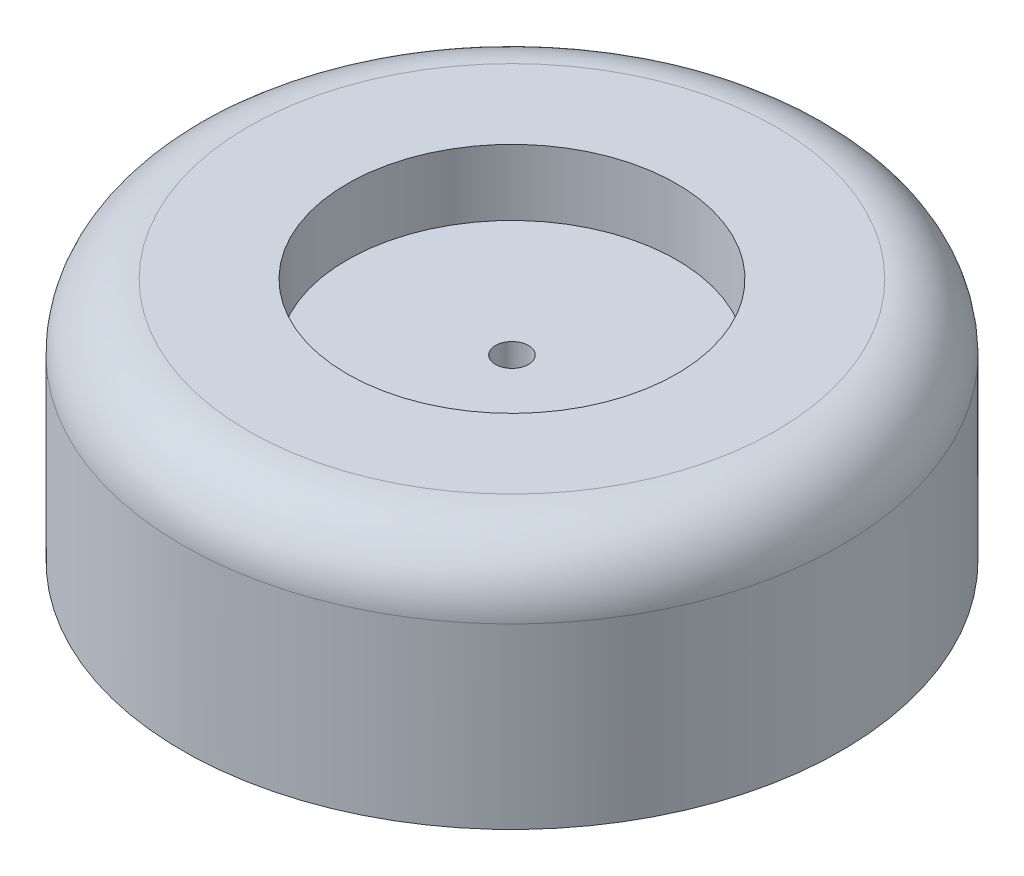
ISO-10303-21;
HEADER;
FILE_DESCRIPTION(('STEP AP214'),'2;1');
FILE_NAME('part.step','',(''),(''),'','','');
FILE_SCHEMA(('AUTOMOTIVE_DESIGN { 1 0 10303 214 1 1 1 1 }'));
ENDSEC;
DATA;
#1=APPLICATION_CONTEXT('core data for automotive mechanical design processes');
#2=APPLICATION_PROTOCOL_DEFINITION('international standard','automotive_design',2000,#1);
#3=PRODUCT_CONTEXT('',#1,'mechanical');
#4=PRODUCT('Part','Part','',(#3));
#5=PRODUCT_RELATED_PRODUCT_CATEGORY('part','',(#4));
#6=PRODUCT_DEFINITION_FORMATION('','',#4);
#7=PRODUCT_DEFINITION_CONTEXT('part definition',#1,'design');
#8=PRODUCT_DEFINITION('design','',#6,#7);
#9=PRODUCT_DEFINITION_SHAPE('','',#8);
#10=(LENGTH_UNIT() NAMED_UNIT(*) SI_UNIT(.MILLI.,.METRE.));
#11=(NAMED_UNIT(*) PLANE_ANGLE_UNIT() SI_UNIT($,.RADIAN.));
#12=(NAMED_UNIT(*) SI_UNIT($,.STERADIAN.) SOLID_ANGLE_UNIT());
#13=UNCERTAINTY_MEASURE_WITH_UNIT(LENGTH_MEASURE(1.E-05),#10,'distance_accuracy_value','');
#14=(GEOMETRIC_REPRESENTATION_CONTEXT(3) GLOBAL_UNCERTAINTY_ASSIGNED_CONTEXT((#13)) GLOBAL_UNIT_ASSIGNED_CONTEXT((#10,
#11,#12)) REPRESENTATION_CONTEXT('',''));
#15=CARTESIAN_POINT('',(0.,0.,0.));
#16=DIRECTION('',(0.,0.,1.));
#17=DIRECTION('',(1.,0.,0.));
#18=AXIS2_PLACEMENT_3D('',#15,#16,#17);
#19=CARTESIAN_POINT('',(0.,3.,0.));
#20=DIRECTION('',(0.,1.,0.));
#21=DIRECTION('',(0.,0.,1.));
#22=AXIS2_PLACEMENT_3D('',#19,#20,#21);
#23=CYLINDRICAL_SURFACE('',#22,2.5);
#24=CARTESIAN_POINT('',(0.,10.,0.));
#25=DIRECTION('',(0.,1.,0.));
#26=DIRECTION('',(0.,0.,1.));
#27=AXIS2_PLACEMENT_3D('',#24,#25,#26);
#28=CIRCLE('',#27,2.5);
#29=CARTESIAN_POINT('',(0.,10.,2.5));
#30=VERTEX_POINT('',#29);
#31=EDGE_CURVE('E141',#30,#30,#28,.T.);
#32=ORIENTED_EDGE('',*,*,#31,.F.);
#33=EDGE_LOOP('',(#32));
#34=FACE_BOUND('',#33,.T.);
#35=CARTESIAN_POINT('',(0.,30.,0.));
#36=DIRECTION('',(0.,1.,0.));
#37=DIRECTION('',(0.,0.,1.));
#38=AXIS2_PLACEMENT_3D('',#35,#36,#37);
#39=CIRCLE('',#38,2.5);
#40=CARTESIAN_POINT('',(0.,30.,2.5));
#41=VERTEX_POINT('',#40);
#42=EDGE_CURVE('E49',#41,#41,#39,.F.);
#43=ORIENTED_EDGE('',*,*,#42,.F.);
#44=EDGE_LOOP('',(#43));
#45=FACE_BOUND('',#44,.T.);
#46=ADVANCED_FACE('F45',(#34,#45),#23,.F.);
#47=CARTESIAN_POINT('',(0.,10.,0.));
#48=DIRECTION('',(0.,-1.,0.));
#49=DIRECTION('',(0.,0.,-1.));
#50=AXIS2_PLACEMENT_3D('',#47,#48,#49);
#51=CYLINDRICAL_SURFACE('',#50,47.5);
#52=CARTESIAN_POINT('',(0.,10.,0.));
#53=DIRECTION('',(0.,1.,0.));
#54=DIRECTION('',(0.,0.,1.));
#55=AXIS2_PLACEMENT_3D('',#52,#53,#54);
#56=CIRCLE('',#55,47.5);
#57=CARTESIAN_POINT('',(0.,10.,47.5));
#58=VERTEX_POINT('',#57);
#59=EDGE_CURVE('E69',#58,#58,#56,.T.);
#60=ORIENTED_EDGE('',*,*,#59,.T.);
#61=EDGE_LOOP('',(#60));
#62=FACE_BOUND('',#61,.T.);
#63=CARTESIAN_POINT('',(0.,3.,0.));
#64=DIRECTION('',(0.,-1.,0.));
#65=DIRECTION('',(0.,0.,-1.));
#66=AXIS2_PLACEMENT_3D('',#63,#64,#65);
#67=CIRCLE('',#66,47.5);
#68=CARTESIAN_POINT('',(0.,3.,-47.5));
#69=VERTEX_POINT('',#68);
#70=EDGE_CURVE('E70',#69,#69,#67,.T.);
#71=ORIENTED_EDGE('',*,*,#70,.T.);
#72=EDGE_LOOP('',(#71));
#73=FACE_BOUND('',#72,.T.);
#74=ADVANCED_FACE('F106',(#62,#73),#51,.F.);
#75=CARTESIAN_POINT('',(0.,10.,0.));
#76=DIRECTION('',(0.,1.,0.));
#77=DIRECTION('',(0.,0.,1.));
#78=AXIS2_PLACEMENT_3D('',#75,#76,#77);
#79=PLANE('',#78);
#80=ORIENTED_EDGE('',*,*,#59,.F.);
#81=EDGE_LOOP('',(#80));
#82=FACE_BOUND('',#81,.T.);
#83=CARTESIAN_POINT('',(0.,10.,0.));
#84=DIRECTION('',(0.,1.,0.));
#85=DIRECTION('',(0.,0.,1.));
#86=AXIS2_PLACEMENT_3D('',#83,#84,#85);
#87=CIRCLE('',#86,45.);
#88=CARTESIAN_POINT('',(45.,10.,0.));
#89=VERTEX_POINT('',#88);
#90=EDGE_CURVE('E67',#89,#89,#87,.T.);
#91=ORIENTED_EDGE('',*,*,#90,.T.);
#92=EDGE_LOOP('',(#91));
#93=FACE_BOUND('',#92,.T.);
#94=ADVANCED_FACE('F113',(#82,#93),#79,.F.);
#95=CARTESIAN_POINT('',(0.,10.,0.));
#96=DIRECTION('',(0.,-1.,0.));
#97=DIRECTION('',(0.,0.,-1.));
#98=AXIS2_PLACEMENT_3D('',#95,#96,#97);
#99=TOROIDAL_SURFACE('',#98,42.5,2.5);
#100=CARTESIAN_POINT('',(42.5,10.,0.));
#101=DIRECTION('',(0.,0.,1.));
#102=DIRECTION('',(1.,0.,0.));
#103=AXIS2_PLACEMENT_3D('',#100,#101,#102);
#104=CIRCLE('',#103,2.5);
#105=CARTESIAN_POINT('',(40.,10.,0.));
#106=VERTEX_POINT('',#105);
#107=EDGE_CURVE('E62',#89,#106,#104,.T.);
#108=ORIENTED_EDGE('',*,*,#107,.T.);
#109=CARTESIAN_POINT('',(0.,10.,0.));
#110=DIRECTION('',(0.,-1.,0.));
#111=DIRECTION('',(0.,0.,-1.));
#112=AXIS2_PLACEMENT_3D('',#109,#110,#111);
#113=CIRCLE('',#112,40.);
#114=EDGE_CURVE('E65',#106,#106,#113,.T.);
#115=ORIENTED_EDGE('',*,*,#114,.F.);
#116=ORIENTED_EDGE('',*,*,#107,.F.);
#117=ORIENTED_EDGE('',*,*,#90,.F.);
#118=EDGE_LOOP('',(#108,#115,#116,#117));
#119=FACE_BOUND('',#118,.T.);
#120=ADVANCED_FACE('F63',(#119),#99,.F.);
#121=ORIENTED_EDGE('',*,*,#31,.T.);
#122=EDGE_LOOP('',(#121));
#123=FACE_BOUND('',#122,.T.);
#124=ORIENTED_EDGE('',*,*,#114,.T.);
#125=EDGE_LOOP('',(#124));
#126=FACE_BOUND('',#125,.T.);
#127=ADVANCED_FACE('F123',(#123,#126),#79,.F.);
#128=CARTESIAN_POINT('',(0.,3.,0.));
#129=DIRECTION('',(0.,-1.,0.));
#130=DIRECTION('',(0.,0.,-1.));
#131=AXIS2_PLACEMENT_3D('',#128,#129,#130);
#132=PLANE('',#131);
#133=ORIENTED_EDGE('',*,*,#70,.F.);
#134=EDGE_LOOP('',(#133));
#135=FACE_BOUND('',#134,.T.);
#136=CARTESIAN_POINT('',(0.,3.,0.));
#137=DIRECTION('',(0.,-1.,0.));
#138=DIRECTION('',(0.,0.,-1.));
#139=AXIS2_PLACEMENT_3D('',#136,#137,#138);
#140=CIRCLE('',#139,50.);
#141=CARTESIAN_POINT('',(0.,3.,-50.));
#142=VERTEX_POINT('',#141);
#143=EDGE_CURVE('E77',#142,#142,#140,.T.);
#144=ORIENTED_EDGE('',*,*,#143,.T.);
#145=EDGE_LOOP('',(#144));
#146=FACE_BOUND('',#145,.T.);
#147=ADVANCED_FACE('F120',(#135,#146),#132,.T.);
#148=CARTESIAN_POINT('',(0.,40.,0.));
#149=DIRECTION('',(0.,1.,0.));
#150=DIRECTION('',(0.,0.,1.));
#151=AXIS2_PLACEMENT_3D('',#148,#149,#150);
#152=PLANE('',#151);
#153=CARTESIAN_POINT('',(0.,40.,0.));
#154=DIRECTION('',(0.,1.,0.));
#155=DIRECTION('',(0.,0.,1.));
#156=AXIS2_PLACEMENT_3D('',#153,#154,#155);
#157=CIRCLE('',#156,25.);
#158=CARTESIAN_POINT('',(0.,40.,25.));
#159=VERTEX_POINT('',#158);
#160=EDGE_CURVE('E149',#159,#159,#157,.T.);
#161=ORIENTED_EDGE('',*,*,#160,.F.);
#162=EDGE_LOOP('',(#161));
#163=FACE_BOUND('',#162,.T.);
#164=CARTESIAN_POINT('',(0.,40.,0.));
#165=DIRECTION('',(0.,1.,0.));
#166=DIRECTION('',(0.,0.,1.));
#167=AXIS2_PLACEMENT_3D('',#164,#165,#166);
#168=CIRCLE('',#167,40.);
#169=CARTESIAN_POINT('',(0.,40.,40.));
#170=VERTEX_POINT('',#169);
#171=EDGE_CURVE('E55',#170,#170,#168,.T.);
#172=ORIENTED_EDGE('',*,*,#171,.T.);
#173=EDGE_LOOP('',(#172));
#174=FACE_BOUND('',#173,.T.);
#175=ADVANCED_FACE('F90',(#163,#174),#152,.T.);
#176=CARTESIAN_POINT('',(0.,10.,0.));
#177=DIRECTION('',(0.,-1.,0.));
#178=DIRECTION('',(0.,0.,-1.));
#179=AXIS2_PLACEMENT_3D('',#176,#177,#178);
#180=CYLINDRICAL_SURFACE('',#179,50.);
#181=CARTESIAN_POINT('',(0.,30.,0.));
#182=DIRECTION('',(0.,1.,0.));
#183=DIRECTION('',(0.,0.,1.));
#184=AXIS2_PLACEMENT_3D('',#181,#182,#183);
#185=CIRCLE('',#184,50.);
#186=CARTESIAN_POINT('',(0.,30.,50.));
#187=VERTEX_POINT('',#186);
#188=EDGE_CURVE('E11',#187,#187,#185,.F.);
#189=ORIENTED_EDGE('',*,*,#188,.T.);
#190=EDGE_LOOP('',(#189));
#191=FACE_BOUND('',#190,.T.);
#192=ORIENTED_EDGE('',*,*,#143,.F.);
#193=EDGE_LOOP('',(#192));
#194=FACE_BOUND('',#193,.T.);
#195=ADVANCED_FACE('F94',(#191,#194),#180,.T.);
#196=CARTESIAN_POINT('',(0.,30.,0.));
#197=DIRECTION('',(0.,1.,0.));
#198=DIRECTION('',(0.,0.,1.));
#199=AXIS2_PLACEMENT_3D('',#196,#197,#198);
#200=TOROIDAL_SURFACE('',#199,40.,10.);
#201=ORIENTED_EDGE('',*,*,#188,.F.);
#202=EDGE_LOOP('',(#201));
#203=FACE_BOUND('',#202,.T.);
#204=ORIENTED_EDGE('',*,*,#171,.F.);
#205=EDGE_LOOP('',(#204));
#206=FACE_BOUND('',#205,.T.);
#207=ADVANCED_FACE('F47',(#203,#206),#200,.T.);
#208=CARTESIAN_POINT('',(0.,30.,0.));
#209=DIRECTION('',(0.,1.,0.));
#210=DIRECTION('',(0.,0.,1.));
#211=AXIS2_PLACEMENT_3D('',#208,#209,#210);
#212=PLANE('',#211);
#213=CARTESIAN_POINT('',(0.,30.,0.));
#214=DIRECTION('',(0.,1.,0.));
#215=DIRECTION('',(0.,0.,1.));
#216=AXIS2_PLACEMENT_3D('',#213,#214,#215);
#217=CIRCLE('',#216,25.);
#218=CARTESIAN_POINT('',(0.,30.,25.));
#219=VERTEX_POINT('',#218);
#220=EDGE_CURVE('E147',#219,#219,#217,.T.);
#221=ORIENTED_EDGE('',*,*,#220,.T.);
#222=EDGE_LOOP('',(#221));
#223=FACE_BOUND('',#222,.T.);
#224=ORIENTED_EDGE('',*,*,#42,.T.);
#225=EDGE_LOOP('',(#224));
#226=FACE_BOUND('',#225,.T.);
#227=ADVANCED_FACE('F93',(#223,#226),#212,.T.);
#228=CARTESIAN_POINT('',(0.,30.,0.));
#229=DIRECTION('',(0.,1.,0.));
#230=DIRECTION('',(0.,0.,1.));
#231=AXIS2_PLACEMENT_3D('',#228,#229,#230);
#232=CYLINDRICAL_SURFACE('',#231,25.);
#233=ORIENTED_EDGE('',*,*,#220,.F.);
#234=EDGE_LOOP('',(#233));
#235=FACE_BOUND('',#234,.T.);
#236=ORIENTED_EDGE('',*,*,#160,.T.);
#237=EDGE_LOOP('',(#236));
#238=FACE_BOUND('',#237,.T.);
#239=ADVANCED_FACE('F101',(#235,#238),#232,.F.);
#240=CLOSED_SHELL('',(#46,#74,#94,#120,#127,#147,#175,#195,#207,#227,#239));
#241=MANIFOLD_SOLID_BREP('B2',#240);
#242=ADVANCED_BREP_SHAPE_REPRESENTATION('',(#18,#241),#14);
#243=SHAPE_DEFINITION_REPRESENTATION(#9,#242);
ENDSEC;
END-ISO-10303-21;
